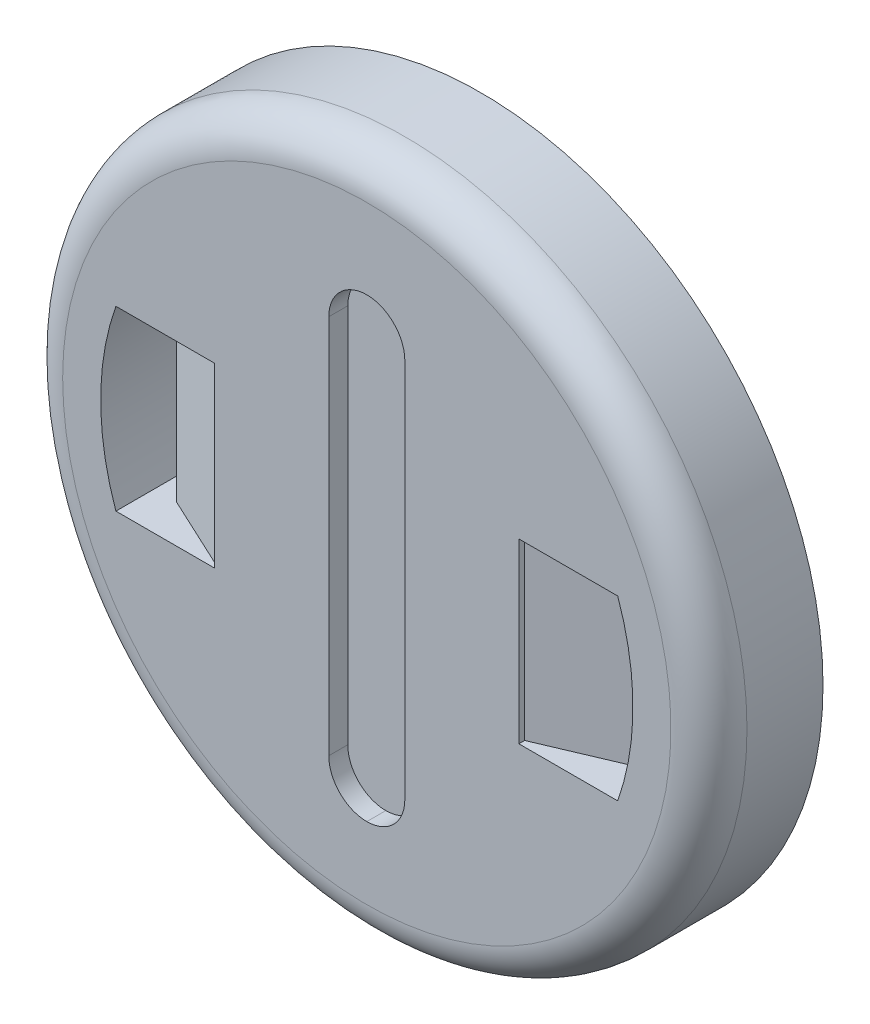
ISO-10303-21;
HEADER;
FILE_DESCRIPTION(('STEP AP214'),'2;1');
FILE_NAME('part.step','',(''),(''),'','','');
FILE_SCHEMA(('AUTOMOTIVE_DESIGN { 1 0 10303 214 1 1 1 1 }'));
ENDSEC;
DATA;
#1=APPLICATION_CONTEXT('core data for automotive mechanical design processes');
#2=APPLICATION_PROTOCOL_DEFINITION('international standard','automotive_design',2000,#1);
#3=PRODUCT_CONTEXT('',#1,'mechanical');
#4=PRODUCT('Part','Part','',(#3));
#5=PRODUCT_RELATED_PRODUCT_CATEGORY('part','',(#4));
#6=PRODUCT_DEFINITION_FORMATION('','',#4);
#7=PRODUCT_DEFINITION_CONTEXT('part definition',#1,'design');
#8=PRODUCT_DEFINITION('design','',#6,#7);
#9=PRODUCT_DEFINITION_SHAPE('','',#8);
#10=(LENGTH_UNIT() NAMED_UNIT(*) SI_UNIT(.MILLI.,.METRE.));
#11=(NAMED_UNIT(*) PLANE_ANGLE_UNIT() SI_UNIT($,.RADIAN.));
#12=(NAMED_UNIT(*) SI_UNIT($,.STERADIAN.) SOLID_ANGLE_UNIT());
#13=UNCERTAINTY_MEASURE_WITH_UNIT(LENGTH_MEASURE(1.E-05),#10,'distance_accuracy_value','');
#14=(GEOMETRIC_REPRESENTATION_CONTEXT(3) GLOBAL_UNCERTAINTY_ASSIGNED_CONTEXT((#13)) GLOBAL_UNIT_ASSIGNED_CONTEXT((#10,
#11,#12)) REPRESENTATION_CONTEXT('',''));
#15=CARTESIAN_POINT('',(0.,0.,0.));
#16=DIRECTION('',(0.,0.,1.));
#17=DIRECTION('',(1.,0.,0.));
#18=AXIS2_PLACEMENT_3D('',#15,#16,#17);
#19=CARTESIAN_POINT('',(0.,0.,14.));
#20=DIRECTION('',(0.,0.,1.));
#21=DIRECTION('',(1.,0.,0.));
#22=AXIS2_PLACEMENT_3D('',#19,#20,#21);
#23=CYLINDRICAL_SURFACE('',#22,7.);
#24=CARTESIAN_POINT('',(0.,0.,12.5));
#25=DIRECTION('',(0.,0.,-1.));
#26=DIRECTION('',(-1.,0.,0.));
#27=AXIS2_PLACEMENT_3D('',#24,#25,#26);
#28=CIRCLE('',#27,7.);
#29=CARTESIAN_POINT('',(6.59966329107444,-2.33333333333333,12.5));
#30=VERTEX_POINT('',#29);
#31=CARTESIAN_POINT('',(6.59966329107444,2.33333333333333,12.5));
#32=VERTEX_POINT('',#31);
#33=EDGE_CURVE('E304',#30,#32,#28,.F.);
#34=ORIENTED_EDGE('',*,*,#33,.F.);
#35=DIRECTION('',(0.,0.,1.));
#36=VECTOR('',#35,1.);
#37=CARTESIAN_POINT('',(6.59966329107444,-2.33333333333333,14.));
#38=LINE('',#37,#36);
#39=CARTESIAN_POINT('',(6.59966329107444,-2.33333333333333,15.));
#40=VERTEX_POINT('',#39);
#41=EDGE_CURVE('E220',#30,#40,#38,.T.);
#42=ORIENTED_EDGE('',*,*,#41,.T.);
#43=CARTESIAN_POINT('',(0.,0.,15.));
#44=DIRECTION('',(0.,0.,1.));
#45=DIRECTION('',(1.,0.,0.));
#46=AXIS2_PLACEMENT_3D('',#43,#44,#45);
#47=CIRCLE('',#46,7.);
#48=CARTESIAN_POINT('',(6.59966329107444,2.33333333333333,15.));
#49=VERTEX_POINT('',#48);
#50=EDGE_CURVE('E210',#40,#49,#47,.T.);
#51=ORIENTED_EDGE('',*,*,#50,.T.);
#52=DIRECTION('',(0.,0.,1.));
#53=VECTOR('',#52,1.);
#54=CARTESIAN_POINT('',(6.59966329107444,2.33333333333333,14.));
#55=LINE('',#54,#53);
#56=EDGE_CURVE('E218',#32,#49,#55,.T.);
#57=ORIENTED_EDGE('',*,*,#56,.F.);
#58=EDGE_LOOP('',(#34,#42,#51,#57));
#59=FACE_BOUND('',#58,.T.);
#60=ADVANCED_FACE('F35',(#59),#23,.F.);
#61=CARTESIAN_POINT('',(0.,0.,12.5));
#62=DIRECTION('',(0.,0.,-1.));
#63=DIRECTION('',(-1.,0.,0.));
#64=AXIS2_PLACEMENT_3D('',#61,#62,#63);
#65=CIRCLE('',#64,7.);
#66=CARTESIAN_POINT('',(-6.59966329107444,2.33333333333333,12.5));
#67=VERTEX_POINT('',#66);
#68=CARTESIAN_POINT('',(-6.59966329107444,-2.33333333333333,12.5));
#69=VERTEX_POINT('',#68);
#70=EDGE_CURVE('E312',#67,#69,#65,.F.);
#71=ORIENTED_EDGE('',*,*,#70,.F.);
#72=DIRECTION('',(0.,0.,1.));
#73=VECTOR('',#72,1.);
#74=CARTESIAN_POINT('',(-6.59966329107444,2.33333333333333,14.));
#75=LINE('',#74,#73);
#76=CARTESIAN_POINT('',(-6.59966329107444,2.33333333333333,15.));
#77=VERTEX_POINT('',#76);
#78=EDGE_CURVE('E171',#67,#77,#75,.T.);
#79=ORIENTED_EDGE('',*,*,#78,.T.);
#80=CARTESIAN_POINT('',(0.,0.,15.));
#81=DIRECTION('',(0.,0.,1.));
#82=DIRECTION('',(1.,0.,0.));
#83=AXIS2_PLACEMENT_3D('',#80,#81,#82);
#84=CIRCLE('',#83,7.);
#85=CARTESIAN_POINT('',(-6.59966329107444,-2.33333333333333,15.));
#86=VERTEX_POINT('',#85);
#87=EDGE_CURVE('E194',#77,#86,#84,.T.);
#88=ORIENTED_EDGE('',*,*,#87,.T.);
#89=DIRECTION('',(0.,0.,1.));
#90=VECTOR('',#89,1.);
#91=CARTESIAN_POINT('',(-6.59966329107444,-2.33333333333333,14.));
#92=LINE('',#91,#90);
#93=EDGE_CURVE('E204',#69,#86,#92,.T.);
#94=ORIENTED_EDGE('',*,*,#93,.F.);
#95=EDGE_LOOP('',(#71,#79,#88,#94));
#96=FACE_BOUND('',#95,.T.);
#97=ADVANCED_FACE('F348',(#96),#23,.F.);
#98=CARTESIAN_POINT('',(4.,2.33333333333333,14.));
#99=DIRECTION('',(0.,1.,0.));
#100=DIRECTION('',(0.,0.,1.));
#101=AXIS2_PLACEMENT_3D('',#98,#99,#100);
#102=PLANE('',#101);
#103=DIRECTION('',(-1.,0.,0.));
#104=VECTOR('',#103,1.);
#105=CARTESIAN_POINT('',(4.,2.33333333333333,12.5));
#106=LINE('',#105,#104);
#107=CARTESIAN_POINT('',(5.99999999999999,2.33333333333333,12.5));
#108=VERTEX_POINT('',#107);
#109=EDGE_CURVE('E51',#32,#108,#106,.T.);
#110=ORIENTED_EDGE('',*,*,#109,.F.);
#111=ORIENTED_EDGE('',*,*,#56,.T.);
#112=DIRECTION('',(-1.,0.,0.));
#113=VECTOR('',#112,1.);
#114=CARTESIAN_POINT('',(4.,2.33333333333333,15.));
#115=LINE('',#114,#113);
#116=CARTESIAN_POINT('',(4.,2.33333333333333,15.));
#117=VERTEX_POINT('',#116);
#118=EDGE_CURVE('E213',#49,#117,#115,.T.);
#119=ORIENTED_EDGE('',*,*,#118,.T.);
#120=DIRECTION('',(0.,0.,1.));
#121=VECTOR('',#120,1.);
#122=CARTESIAN_POINT('',(4.,2.33333333333333,14.));
#123=LINE('',#122,#121);
#124=CARTESIAN_POINT('',(4.,2.33333333333333,14.8489496324192));
#125=VERTEX_POINT('',#124);
#126=EDGE_CURVE('E192',#125,#117,#123,.T.);
#127=ORIENTED_EDGE('',*,*,#126,.F.);
#128=DIRECTION('',(0.920504853452439,0.,-0.390731128489278));
#129=VECTOR('',#128,1.);
#130=CARTESIAN_POINT('',(5.99999999999999,2.33333333333333,14.));
#131=LINE('',#130,#129);
#132=CARTESIAN_POINT('',(5.99999999999999,2.33333333333333,14.));
#133=VERTEX_POINT('',#132);
#134=EDGE_CURVE('E44',#125,#133,#131,.T.);
#135=ORIENTED_EDGE('',*,*,#134,.T.);
#136=DIRECTION('',(0.,0.,1.));
#137=VECTOR('',#136,1.);
#138=CARTESIAN_POINT('',(5.99999999999999,2.33333333333333,-7.24115958621575));
#139=LINE('',#138,#137);
#140=EDGE_CURVE('E296',#108,#133,#139,.T.);
#141=ORIENTED_EDGE('',*,*,#140,.F.);
#142=EDGE_LOOP('',(#110,#111,#119,#127,#135,#141));
#143=FACE_BOUND('',#142,.T.);
#144=ADVANCED_FACE('F295',(#143),#102,.F.);
#145=CARTESIAN_POINT('',(4.,-2.33333333333333,14.));
#146=DIRECTION('',(0.,-1.,0.));
#147=DIRECTION('',(0.,0.,-1.));
#148=AXIS2_PLACEMENT_3D('',#145,#146,#147);
#149=PLANE('',#148);
#150=DIRECTION('',(1.,0.,0.));
#151=VECTOR('',#150,1.);
#152=CARTESIAN_POINT('',(4.,-2.33333333333333,12.5));
#153=LINE('',#152,#151);
#154=CARTESIAN_POINT('',(5.99999999999999,-2.33333333333333,12.5));
#155=VERTEX_POINT('',#154);
#156=EDGE_CURVE('E309',#155,#30,#153,.T.);
#157=ORIENTED_EDGE('',*,*,#156,.F.);
#158=DIRECTION('',(0.,0.,1.));
#159=VECTOR('',#158,1.);
#160=CARTESIAN_POINT('',(5.99999999999999,-2.33333333333333,-7.24115958621575));
#161=LINE('',#160,#159);
#162=CARTESIAN_POINT('',(5.99999999999999,-2.33333333333333,14.));
#163=VERTEX_POINT('',#162);
#164=EDGE_CURVE('E184',#155,#163,#161,.T.);
#165=ORIENTED_EDGE('',*,*,#164,.T.);
#166=DIRECTION('',(-0.920504853452439,0.,0.390731128489278));
#167=VECTOR('',#166,1.);
#168=CARTESIAN_POINT('',(5.99999999999999,-2.33333333333333,14.));
#169=LINE('',#168,#167);
#170=CARTESIAN_POINT('',(4.,-2.33333333333333,14.8489496324192));
#171=VERTEX_POINT('',#170);
#172=EDGE_CURVE('E286',#163,#171,#169,.T.);
#173=ORIENTED_EDGE('',*,*,#172,.T.);
#174=DIRECTION('',(0.,0.,1.));
#175=VECTOR('',#174,1.);
#176=CARTESIAN_POINT('',(4.,-2.33333333333333,14.));
#177=LINE('',#176,#175);
#178=CARTESIAN_POINT('',(4.,-2.33333333333333,15.));
#179=VERTEX_POINT('',#178);
#180=EDGE_CURVE('E216',#171,#179,#177,.T.);
#181=ORIENTED_EDGE('',*,*,#180,.T.);
#182=DIRECTION('',(1.,0.,0.));
#183=VECTOR('',#182,1.);
#184=CARTESIAN_POINT('',(4.,-2.33333333333333,15.));
#185=LINE('',#184,#183);
#186=EDGE_CURVE('E182',#179,#40,#185,.T.);
#187=ORIENTED_EDGE('',*,*,#186,.T.);
#188=ORIENTED_EDGE('',*,*,#41,.F.);
#189=EDGE_LOOP('',(#157,#165,#173,#181,#187,#188));
#190=FACE_BOUND('',#189,.T.);
#191=ADVANCED_FACE('F370',(#190),#149,.F.);
#192=CARTESIAN_POINT('',(-6.59966329107444,-2.33333333333333,14.));
#193=DIRECTION('',(0.,-1.,0.));
#194=DIRECTION('',(1.,0.,0.));
#195=AXIS2_PLACEMENT_3D('',#192,#193,#194);
#196=PLANE('',#195);
#197=DIRECTION('',(1.,0.,0.));
#198=VECTOR('',#197,1.);
#199=CARTESIAN_POINT('',(-6.59966329107444,-2.33333333333333,12.5));
#200=LINE('',#199,#198);
#201=CARTESIAN_POINT('',(-5.99999999999998,-2.33333333333333,12.5));
#202=VERTEX_POINT('',#201);
#203=EDGE_CURVE('E58',#69,#202,#200,.T.);
#204=ORIENTED_EDGE('',*,*,#203,.F.);
#205=ORIENTED_EDGE('',*,*,#93,.T.);
#206=DIRECTION('',(1.,0.,0.));
#207=VECTOR('',#206,1.);
#208=CARTESIAN_POINT('',(-6.59966329107444,-2.33333333333333,15.));
#209=LINE('',#208,#207);
#210=CARTESIAN_POINT('',(-4.,-2.33333333333333,15.));
#211=VERTEX_POINT('',#210);
#212=EDGE_CURVE('E197',#86,#211,#209,.T.);
#213=ORIENTED_EDGE('',*,*,#212,.T.);
#214=DIRECTION('',(0.,0.,1.));
#215=VECTOR('',#214,1.);
#216=CARTESIAN_POINT('',(-4.,-2.33333333333333,14.));
#217=LINE('',#216,#215);
#218=CARTESIAN_POINT('',(-4.,-2.33333333333333,14.93261531631));
#219=VERTEX_POINT('',#218);
#220=EDGE_CURVE('E201',#219,#211,#217,.T.);
#221=ORIENTED_EDGE('',*,*,#220,.F.);
#222=DIRECTION('',(-0.906307787036647,0.,-0.422618261740704));
#223=VECTOR('',#222,1.);
#224=CARTESIAN_POINT('',(-5.99999999999998,-2.33333333333333,14.));
#225=LINE('',#224,#223);
#226=CARTESIAN_POINT('',(-5.99999999999998,-2.33333333333333,14.));
#227=VERTEX_POINT('',#226);
#228=EDGE_CURVE('E280',#219,#227,#225,.T.);
#229=ORIENTED_EDGE('',*,*,#228,.T.);
#230=DIRECTION('',(0.,0.,1.));
#231=VECTOR('',#230,1.);
#232=CARTESIAN_POINT('',(-5.99999999999998,-2.33333333333333,-7.24115958621575));
#233=LINE('',#232,#231);
#234=EDGE_CURVE('E179',#202,#227,#233,.T.);
#235=ORIENTED_EDGE('',*,*,#234,.F.);
#236=EDGE_LOOP('',(#204,#205,#213,#221,#229,#235));
#237=FACE_BOUND('',#236,.T.);
#238=ADVANCED_FACE('F358',(#237),#196,.F.);
#239=CARTESIAN_POINT('',(-6.59966329107444,2.33333333333333,14.));
#240=DIRECTION('',(0.,1.,0.));
#241=DIRECTION('',(0.,0.,1.));
#242=AXIS2_PLACEMENT_3D('',#239,#240,#241);
#243=PLANE('',#242);
#244=DIRECTION('',(-1.,0.,0.));
#245=VECTOR('',#244,1.);
#246=CARTESIAN_POINT('',(-6.59966329107444,2.33333333333333,12.5));
#247=LINE('',#246,#245);
#248=CARTESIAN_POINT('',(-5.99999999999998,2.33333333333333,12.5));
#249=VERTEX_POINT('',#248);
#250=EDGE_CURVE('E160',#249,#67,#247,.T.);
#251=ORIENTED_EDGE('',*,*,#250,.F.);
#252=DIRECTION('',(0.,0.,1.));
#253=VECTOR('',#252,1.);
#254=CARTESIAN_POINT('',(-5.99999999999998,2.33333333333333,-7.24115958621575));
#255=LINE('',#254,#253);
#256=CARTESIAN_POINT('',(-5.99999999999998,2.33333333333333,14.));
#257=VERTEX_POINT('',#256);
#258=EDGE_CURVE('E168',#249,#257,#255,.T.);
#259=ORIENTED_EDGE('',*,*,#258,.T.);
#260=DIRECTION('',(0.906307787036647,0.,0.422618261740704));
#261=VECTOR('',#260,1.);
#262=CARTESIAN_POINT('',(-5.99999999999998,2.33333333333333,14.));
#263=LINE('',#262,#261);
#264=CARTESIAN_POINT('',(-4.,2.33333333333333,14.93261531631));
#265=VERTEX_POINT('',#264);
#266=EDGE_CURVE('E276',#257,#265,#263,.T.);
#267=ORIENTED_EDGE('',*,*,#266,.T.);
#268=DIRECTION('',(0.,0.,1.));
#269=VECTOR('',#268,1.);
#270=CARTESIAN_POINT('',(-4.,2.33333333333333,14.));
#271=LINE('',#270,#269);
#272=CARTESIAN_POINT('',(-4.,2.33333333333333,15.));
#273=VERTEX_POINT('',#272);
#274=EDGE_CURVE('E200',#265,#273,#271,.T.);
#275=ORIENTED_EDGE('',*,*,#274,.T.);
#276=DIRECTION('',(-1.,0.,0.));
#277=VECTOR('',#276,1.);
#278=CARTESIAN_POINT('',(-6.59966329107444,2.33333333333333,15.));
#279=LINE('',#278,#277);
#280=EDGE_CURVE('E191',#273,#77,#279,.T.);
#281=ORIENTED_EDGE('',*,*,#280,.T.);
#282=ORIENTED_EDGE('',*,*,#78,.F.);
#283=EDGE_LOOP('',(#251,#259,#267,#275,#281,#282));
#284=FACE_BOUND('',#283,.T.);
#285=ADVANCED_FACE('F167',(#284),#243,.F.);
#286=CARTESIAN_POINT('',(5.99999999999999,2.33333333333333,-7.24115958621575));
#287=DIRECTION('',(-1.,0.,0.));
#288=DIRECTION('',(0.,0.,1.));
#289=AXIS2_PLACEMENT_3D('',#286,#287,#288);
#290=PLANE('',#289);
#291=DIRECTION('',(0.,-1.,0.));
#292=VECTOR('',#291,1.);
#293=CARTESIAN_POINT('',(5.99999999999999,2.33333333333333,12.5));
#294=LINE('',#293,#292);
#295=EDGE_CURVE('E303',#108,#155,#294,.T.);
#296=ORIENTED_EDGE('',*,*,#295,.F.);
#297=ORIENTED_EDGE('',*,*,#140,.T.);
#298=DIRECTION('',(0.,-1.,0.));
#299=VECTOR('',#298,1.);
#300=CARTESIAN_POINT('',(5.99999999999999,0.,14.));
#301=LINE('',#300,#299);
#302=EDGE_CURVE('E283',#133,#163,#301,.T.);
#303=ORIENTED_EDGE('',*,*,#302,.T.);
#304=ORIENTED_EDGE('',*,*,#164,.F.);
#305=EDGE_LOOP('',(#296,#297,#303,#304));
#306=FACE_BOUND('',#305,.T.);
#307=ADVANCED_FACE('F302',(#306),#290,.F.);
#308=CARTESIAN_POINT('',(-5.99999999999998,-2.33333333333333,-7.24115958621575));
#309=DIRECTION('',(1.,0.,0.));
#310=DIRECTION('',(0.,0.,-1.));
#311=AXIS2_PLACEMENT_3D('',#308,#309,#310);
#312=PLANE('',#311);
#313=DIRECTION('',(0.,1.,0.));
#314=VECTOR('',#313,1.);
#315=CARTESIAN_POINT('',(-5.99999999999998,-2.33333333333333,12.5));
#316=LINE('',#315,#314);
#317=EDGE_CURVE('E11',#202,#249,#316,.T.);
#318=ORIENTED_EDGE('',*,*,#317,.F.);
#319=ORIENTED_EDGE('',*,*,#234,.T.);
#320=DIRECTION('',(0.,1.,0.));
#321=VECTOR('',#320,1.);
#322=CARTESIAN_POINT('',(-5.99999999999998,0.,14.));
#323=LINE('',#322,#321);
#324=EDGE_CURVE('E177',#227,#257,#323,.T.);
#325=ORIENTED_EDGE('',*,*,#324,.T.);
#326=ORIENTED_EDGE('',*,*,#258,.F.);
#327=EDGE_LOOP('',(#318,#319,#325,#326));
#328=FACE_BOUND('',#327,.T.);
#329=ADVANCED_FACE('F175',(#328),#312,.F.);
#330=CARTESIAN_POINT('',(0.,0.,15.));
#331=DIRECTION('',(0.,0.,-1.));
#332=DIRECTION('',(-1.,0.,0.));
#333=AXIS2_PLACEMENT_3D('',#330,#331,#332);
#334=CYLINDRICAL_SURFACE('',#333,9.);
#335=CARTESIAN_POINT('',(0.,0.,14.));
#336=DIRECTION('',(0.,0.,-1.));
#337=DIRECTION('',(-1.,0.,0.));
#338=AXIS2_PLACEMENT_3D('',#335,#336,#337);
#339=CIRCLE('',#338,9.);
#340=CARTESIAN_POINT('',(-9.,0.,14.));
#341=VERTEX_POINT('',#340);
#342=EDGE_CURVE('E239',#341,#341,#339,.T.);
#343=ORIENTED_EDGE('',*,*,#342,.T.);
#344=EDGE_LOOP('',(#343));
#345=FACE_BOUND('',#344,.T.);
#346=CARTESIAN_POINT('',(0.,0.,12.));
#347=DIRECTION('',(0.,0.,-1.));
#348=DIRECTION('',(-1.,0.,0.));
#349=AXIS2_PLACEMENT_3D('',#346,#347,#348);
#350=CIRCLE('',#349,9.);
#351=CARTESIAN_POINT('',(-9.,0.,12.));
#352=VERTEX_POINT('',#351);
#353=EDGE_CURVE('E230',#352,#352,#350,.T.);
#354=ORIENTED_EDGE('',*,*,#353,.F.);
#355=EDGE_LOOP('',(#354));
#356=FACE_BOUND('',#355,.T.);
#357=ADVANCED_FACE('F335',(#345,#356),#334,.T.);
#358=CARTESIAN_POINT('',(0.,0.,15.));
#359=DIRECTION('',(0.,0.,-1.));
#360=DIRECTION('',(-1.,0.,0.));
#361=AXIS2_PLACEMENT_3D('',#358,#359,#360);
#362=PLANE('',#361);
#363=ORIENTED_EDGE('',*,*,#280,.F.);
#364=DIRECTION('',(0.,1.,0.));
#365=VECTOR('',#364,1.);
#366=CARTESIAN_POINT('',(-4.,2.33333333333333,15.));
#367=LINE('',#366,#365);
#368=EDGE_CURVE('E188',#211,#273,#367,.T.);
#369=ORIENTED_EDGE('',*,*,#368,.F.);
#370=ORIENTED_EDGE('',*,*,#212,.F.);
#371=ORIENTED_EDGE('',*,*,#87,.F.);
#372=EDGE_LOOP('',(#363,#369,#370,#371));
#373=FACE_BOUND('',#372,.T.);
#374=ORIENTED_EDGE('',*,*,#186,.F.);
#375=DIRECTION('',(0.,-1.,0.));
#376=VECTOR('',#375,1.);
#377=CARTESIAN_POINT('',(4.,2.33333333333333,15.));
#378=LINE('',#377,#376);
#379=EDGE_CURVE('E178',#117,#179,#378,.T.);
#380=ORIENTED_EDGE('',*,*,#379,.F.);
#381=ORIENTED_EDGE('',*,*,#118,.F.);
#382=ORIENTED_EDGE('',*,*,#50,.F.);
#383=EDGE_LOOP('',(#374,#380,#381,#382));
#384=FACE_BOUND('',#383,.T.);
#385=CARTESIAN_POINT('',(0.,-5.10540648566572,15.));
#386=DIRECTION('',(0.,0.,-1.));
#387=DIRECTION('',(-1.,0.,0.));
#388=AXIS2_PLACEMENT_3D('',#385,#386,#387);
#389=CIRCLE('',#388,1.);
#390=CARTESIAN_POINT('',(1.,-5.10540648566572,15.));
#391=VERTEX_POINT('',#390);
#392=CARTESIAN_POINT('',(0.,-6.10540648566572,15.));
#393=VERTEX_POINT('',#392);
#394=EDGE_CURVE('E263',#391,#393,#389,.T.);
#395=ORIENTED_EDGE('',*,*,#394,.T.);
#396=CARTESIAN_POINT('',(0.,-5.10540648566572,15.));
#397=DIRECTION('',(0.,0.,-1.));
#398=DIRECTION('',(-1.,0.,0.));
#399=AXIS2_PLACEMENT_3D('',#396,#397,#398);
#400=CIRCLE('',#399,1.);
#401=CARTESIAN_POINT('',(-0.999999999999998,-5.10540648566572,15.));
#402=VERTEX_POINT('',#401);
#403=EDGE_CURVE('E265',#393,#402,#400,.T.);
#404=ORIENTED_EDGE('',*,*,#403,.T.);
#405=DIRECTION('',(0.,-1.,0.));
#406=VECTOR('',#405,1.);
#407=CARTESIAN_POINT('',(-1.,5.89459351433428,15.));
#408=LINE('',#407,#406);
#409=CARTESIAN_POINT('',(-1.,4.89459351433428,15.));
#410=VERTEX_POINT('',#409);
#411=EDGE_CURVE('E231',#410,#402,#408,.T.);
#412=ORIENTED_EDGE('',*,*,#411,.F.);
#413=CARTESIAN_POINT('',(0.,4.89459351433428,15.));
#414=DIRECTION('',(0.,0.,-1.));
#415=DIRECTION('',(-1.,0.,0.));
#416=AXIS2_PLACEMENT_3D('',#413,#414,#415);
#417=CIRCLE('',#416,1.);
#418=CARTESIAN_POINT('',(0.,5.89459351433428,15.));
#419=VERTEX_POINT('',#418);
#420=EDGE_CURVE('E269',#410,#419,#417,.T.);
#421=ORIENTED_EDGE('',*,*,#420,.T.);
#422=CARTESIAN_POINT('',(0.,4.89459351433428,15.));
#423=DIRECTION('',(0.,0.,-1.));
#424=DIRECTION('',(-1.,0.,0.));
#425=AXIS2_PLACEMENT_3D('',#422,#423,#424);
#426=CIRCLE('',#425,1.);
#427=CARTESIAN_POINT('',(1.,4.89459351433428,15.));
#428=VERTEX_POINT('',#427);
#429=EDGE_CURVE('E267',#419,#428,#426,.T.);
#430=ORIENTED_EDGE('',*,*,#429,.T.);
#431=DIRECTION('',(0.,1.,0.));
#432=VECTOR('',#431,1.);
#433=CARTESIAN_POINT('',(1.,5.89459351433428,15.));
#434=LINE('',#433,#432);
#435=EDGE_CURVE('E227',#391,#428,#434,.T.);
#436=ORIENTED_EDGE('',*,*,#435,.F.);
#437=EDGE_LOOP('',(#395,#404,#412,#421,#430,#436));
#438=FACE_BOUND('',#437,.T.);
#439=CARTESIAN_POINT('',(0.,0.,15.));
#440=DIRECTION('',(0.,0.,-1.));
#441=DIRECTION('',(-1.,0.,0.));
#442=AXIS2_PLACEMENT_3D('',#439,#440,#441);
#443=CIRCLE('',#442,8.);
#444=CARTESIAN_POINT('',(-8.,0.,15.));
#445=VERTEX_POINT('',#444);
#446=EDGE_CURVE('E242',#445,#445,#443,.F.);
#447=ORIENTED_EDGE('',*,*,#446,.T.);
#448=EDGE_LOOP('',(#447));
#449=FACE_BOUND('',#448,.T.);
#450=ADVANCED_FACE('F331',(#373,#384,#438,#449),#362,.F.);
#451=CARTESIAN_POINT('',(0.,0.,12.));
#452=DIRECTION('',(0.,0.,-1.));
#453=DIRECTION('',(-1.,0.,0.));
#454=AXIS2_PLACEMENT_3D('',#451,#452,#453);
#455=PLANE('',#454);
#456=CARTESIAN_POINT('',(0.,0.,12.));
#457=DIRECTION('',(0.,0.,-1.));
#458=DIRECTION('',(-1.,0.,0.));
#459=AXIS2_PLACEMENT_3D('',#456,#457,#458);
#460=CIRCLE('',#459,8.);
#461=CARTESIAN_POINT('',(-8.,0.,12.));
#462=VERTEX_POINT('',#461);
#463=EDGE_CURVE('E315',#462,#462,#460,.T.);
#464=ORIENTED_EDGE('',*,*,#463,.F.);
#465=EDGE_LOOP('',(#464));
#466=FACE_BOUND('',#465,.T.);
#467=ORIENTED_EDGE('',*,*,#353,.T.);
#468=EDGE_LOOP('',(#467));
#469=FACE_BOUND('',#468,.T.);
#470=ADVANCED_FACE('F327',(#466,#469),#455,.T.);
#471=CARTESIAN_POINT('',(0.,0.,14.));
#472=DIRECTION('',(0.,0.,-1.));
#473=DIRECTION('',(-1.,0.,0.));
#474=AXIS2_PLACEMENT_3D('',#471,#472,#473);
#475=TOROIDAL_SURFACE('',#474,8.,1.);
#476=ORIENTED_EDGE('',*,*,#446,.F.);
#477=EDGE_LOOP('',(#476));
#478=FACE_BOUND('',#477,.T.);
#479=ORIENTED_EDGE('',*,*,#342,.F.);
#480=EDGE_LOOP('',(#479));
#481=FACE_BOUND('',#480,.T.);
#482=ADVANCED_FACE('F330',(#478,#481),#475,.T.);
#483=CARTESIAN_POINT('',(-1.,5.89459351433428,14.5));
#484=DIRECTION('',(-1.,0.,0.));
#485=DIRECTION('',(0.,-1.,0.));
#486=AXIS2_PLACEMENT_3D('',#483,#484,#485);
#487=PLANE('',#486);
#488=ORIENTED_EDGE('',*,*,#411,.T.);
#489=DIRECTION('',(0.,0.,1.));
#490=VECTOR('',#489,1.);
#491=CARTESIAN_POINT('',(-0.999999999999998,-5.10540648566572,14.5));
#492=LINE('',#491,#490);
#493=CARTESIAN_POINT('',(-0.999999999999998,-5.10540648566572,14.5));
#494=VERTEX_POINT('',#493);
#495=EDGE_CURVE('E261',#402,#494,#492,.F.);
#496=ORIENTED_EDGE('',*,*,#495,.T.);
#497=DIRECTION('',(0.,-1.,0.));
#498=VECTOR('',#497,1.);
#499=CARTESIAN_POINT('',(-1.,5.89459351433428,14.5));
#500=LINE('',#499,#498);
#501=CARTESIAN_POINT('',(-1.,4.89459351433428,14.5));
#502=VERTEX_POINT('',#501);
#503=EDGE_CURVE('E223',#502,#494,#500,.T.);
#504=ORIENTED_EDGE('',*,*,#503,.F.);
#505=DIRECTION('',(0.,0.,1.));
#506=VECTOR('',#505,1.);
#507=CARTESIAN_POINT('',(-1.,4.89459351433428,15.));
#508=LINE('',#507,#506);
#509=EDGE_CURVE('E259',#502,#410,#508,.T.);
#510=ORIENTED_EDGE('',*,*,#509,.T.);
#511=EDGE_LOOP('',(#488,#496,#504,#510));
#512=FACE_BOUND('',#511,.T.);
#513=ADVANCED_FACE('F386',(#512),#487,.F.);
#514=CARTESIAN_POINT('',(1.,5.89459351433428,14.5));
#515=DIRECTION('',(1.,0.,0.));
#516=DIRECTION('',(0.,1.,0.));
#517=AXIS2_PLACEMENT_3D('',#514,#515,#516);
#518=PLANE('',#517);
#519=DIRECTION('',(0.,1.,0.));
#520=VECTOR('',#519,1.);
#521=CARTESIAN_POINT('',(1.,5.89459351433428,14.5));
#522=LINE('',#521,#520);
#523=CARTESIAN_POINT('',(1.,-5.10540648566572,14.5));
#524=VERTEX_POINT('',#523);
#525=CARTESIAN_POINT('',(1.,4.89459351433428,14.5));
#526=VERTEX_POINT('',#525);
#527=EDGE_CURVE('E226',#524,#526,#522,.T.);
#528=ORIENTED_EDGE('',*,*,#527,.F.);
#529=DIRECTION('',(0.,0.,1.));
#530=VECTOR('',#529,1.);
#531=CARTESIAN_POINT('',(1.,-5.10540648566572,15.));
#532=LINE('',#531,#530);
#533=EDGE_CURVE('E248',#524,#391,#532,.T.);
#534=ORIENTED_EDGE('',*,*,#533,.T.);
#535=ORIENTED_EDGE('',*,*,#435,.T.);
#536=DIRECTION('',(0.,0.,1.));
#537=VECTOR('',#536,1.);
#538=CARTESIAN_POINT('',(1.,4.89459351433428,14.5));
#539=LINE('',#538,#537);
#540=EDGE_CURVE('E245',#428,#526,#539,.F.);
#541=ORIENTED_EDGE('',*,*,#540,.T.);
#542=EDGE_LOOP('',(#528,#534,#535,#541));
#543=FACE_BOUND('',#542,.T.);
#544=ADVANCED_FACE('F382',(#543),#518,.F.);
#545=CARTESIAN_POINT('',(0.,0.,14.5));
#546=DIRECTION('',(0.,0.,1.));
#547=DIRECTION('',(1.,0.,0.));
#548=AXIS2_PLACEMENT_3D('',#545,#546,#547);
#549=PLANE('',#548);
#550=CARTESIAN_POINT('',(0.,-5.10540648566572,14.5));
#551=DIRECTION('',(0.,0.,1.));
#552=DIRECTION('',(1.,0.,0.));
#553=AXIS2_PLACEMENT_3D('',#550,#551,#552);
#554=CIRCLE('',#553,1.);
#555=CARTESIAN_POINT('',(0.,-6.10540648566572,14.5));
#556=VERTEX_POINT('',#555);
#557=EDGE_CURVE('E255',#494,#556,#554,.T.);
#558=ORIENTED_EDGE('',*,*,#557,.T.);
#559=CARTESIAN_POINT('',(0.,-5.10540648566572,14.5));
#560=DIRECTION('',(0.,0.,1.));
#561=DIRECTION('',(1.,0.,0.));
#562=AXIS2_PLACEMENT_3D('',#559,#560,#561);
#563=CIRCLE('',#562,1.);
#564=EDGE_CURVE('E257',#556,#524,#563,.T.);
#565=ORIENTED_EDGE('',*,*,#564,.T.);
#566=ORIENTED_EDGE('',*,*,#527,.T.);
#567=CARTESIAN_POINT('',(0.,4.89459351433428,14.5));
#568=DIRECTION('',(0.,0.,1.));
#569=DIRECTION('',(1.,0.,0.));
#570=AXIS2_PLACEMENT_3D('',#567,#568,#569);
#571=CIRCLE('',#570,1.);
#572=CARTESIAN_POINT('',(0.,5.89459351433428,14.5));
#573=VERTEX_POINT('',#572);
#574=EDGE_CURVE('E253',#526,#573,#571,.T.);
#575=ORIENTED_EDGE('',*,*,#574,.T.);
#576=CARTESIAN_POINT('',(0.,4.89459351433428,14.5));
#577=DIRECTION('',(0.,0.,1.));
#578=DIRECTION('',(1.,0.,0.));
#579=AXIS2_PLACEMENT_3D('',#576,#577,#578);
#580=CIRCLE('',#579,1.);
#581=EDGE_CURVE('E251',#573,#502,#580,.T.);
#582=ORIENTED_EDGE('',*,*,#581,.T.);
#583=ORIENTED_EDGE('',*,*,#503,.T.);
#584=EDGE_LOOP('',(#558,#565,#566,#575,#582,#583));
#585=FACE_BOUND('',#584,.T.);
#586=ADVANCED_FACE('F378',(#585),#549,.T.);
#587=CARTESIAN_POINT('',(0.,-5.10540648566572,14.5));
#588=DIRECTION('',(0.,0.,-1.));
#589=DIRECTION('',(-1.,0.,0.));
#590=AXIS2_PLACEMENT_3D('',#587,#588,#589);
#591=CYLINDRICAL_SURFACE('',#590,1.);
#592=DIRECTION('',(0.,0.,1.));
#593=VECTOR('',#592,1.);
#594=CARTESIAN_POINT('',(0.,-6.10540648566572,15.));
#595=LINE('',#594,#593);
#596=EDGE_CURVE('E234',#556,#393,#595,.T.);
#597=ORIENTED_EDGE('',*,*,#596,.F.);
#598=ORIENTED_EDGE('',*,*,#557,.F.);
#599=ORIENTED_EDGE('',*,*,#495,.F.);
#600=ORIENTED_EDGE('',*,*,#403,.F.);
#601=EDGE_LOOP('',(#597,#598,#599,#600));
#602=FACE_BOUND('',#601,.T.);
#603=ADVANCED_FACE('F381',(#602),#591,.F.);
#604=CARTESIAN_POINT('',(0.,-5.10540648566572,14.5));
#605=DIRECTION('',(0.,0.,-1.));
#606=DIRECTION('',(-1.,0.,0.));
#607=AXIS2_PLACEMENT_3D('',#604,#605,#606);
#608=CYLINDRICAL_SURFACE('',#607,1.);
#609=ORIENTED_EDGE('',*,*,#564,.F.);
#610=ORIENTED_EDGE('',*,*,#596,.T.);
#611=ORIENTED_EDGE('',*,*,#394,.F.);
#612=ORIENTED_EDGE('',*,*,#533,.F.);
#613=EDGE_LOOP('',(#609,#610,#611,#612));
#614=FACE_BOUND('',#613,.T.);
#615=ADVANCED_FACE('F417',(#614),#608,.F.);
#616=CARTESIAN_POINT('',(0.,4.89459351433428,14.5));
#617=DIRECTION('',(0.,0.,-1.));
#618=DIRECTION('',(-1.,0.,0.));
#619=AXIS2_PLACEMENT_3D('',#616,#617,#618);
#620=CYLINDRICAL_SURFACE('',#619,1.);
#621=ORIENTED_EDGE('',*,*,#509,.F.);
#622=ORIENTED_EDGE('',*,*,#581,.F.);
#623=DIRECTION('',(0.,0.,1.));
#624=VECTOR('',#623,1.);
#625=CARTESIAN_POINT('',(0.,5.89459351433428,14.5));
#626=LINE('',#625,#624);
#627=EDGE_CURVE('E203',#419,#573,#626,.F.);
#628=ORIENTED_EDGE('',*,*,#627,.F.);
#629=ORIENTED_EDGE('',*,*,#420,.F.);
#630=EDGE_LOOP('',(#621,#622,#628,#629));
#631=FACE_BOUND('',#630,.T.);
#632=ADVANCED_FACE('F408',(#631),#620,.F.);
#633=CARTESIAN_POINT('',(0.,4.89459351433428,14.5));
#634=DIRECTION('',(0.,0.,-1.));
#635=DIRECTION('',(-1.,0.,0.));
#636=AXIS2_PLACEMENT_3D('',#633,#634,#635);
#637=CYLINDRICAL_SURFACE('',#636,1.);
#638=ORIENTED_EDGE('',*,*,#574,.F.);
#639=ORIENTED_EDGE('',*,*,#540,.F.);
#640=ORIENTED_EDGE('',*,*,#429,.F.);
#641=ORIENTED_EDGE('',*,*,#627,.T.);
#642=EDGE_LOOP('',(#638,#639,#640,#641));
#643=FACE_BOUND('',#642,.T.);
#644=ADVANCED_FACE('F376',(#643),#637,.F.);
#645=CARTESIAN_POINT('',(4.,2.33333333333333,14.));
#646=DIRECTION('',(-1.,0.,0.));
#647=DIRECTION('',(0.,0.,1.));
#648=AXIS2_PLACEMENT_3D('',#645,#646,#647);
#649=PLANE('',#648);
#650=ORIENTED_EDGE('',*,*,#180,.F.);
#651=DIRECTION('',(0.,1.,0.));
#652=VECTOR('',#651,1.);
#653=CARTESIAN_POINT('',(4.,2.33333333333333,14.8489496324192));
#654=LINE('',#653,#652);
#655=EDGE_CURVE('E288',#171,#125,#654,.T.);
#656=ORIENTED_EDGE('',*,*,#655,.T.);
#657=ORIENTED_EDGE('',*,*,#126,.T.);
#658=ORIENTED_EDGE('',*,*,#379,.T.);
#659=EDGE_LOOP('',(#650,#656,#657,#658));
#660=FACE_BOUND('',#659,.T.);
#661=ADVANCED_FACE('F366',(#660),#649,.F.);
#662=CARTESIAN_POINT('',(-4.,2.33333333333333,14.));
#663=DIRECTION('',(1.,0.,0.));
#664=DIRECTION('',(0.,0.,-1.));
#665=AXIS2_PLACEMENT_3D('',#662,#663,#664);
#666=PLANE('',#665);
#667=ORIENTED_EDGE('',*,*,#274,.F.);
#668=DIRECTION('',(0.,-1.,0.));
#669=VECTOR('',#668,1.);
#670=CARTESIAN_POINT('',(-4.,2.33333333333333,14.93261531631));
#671=LINE('',#670,#669);
#672=EDGE_CURVE('E278',#265,#219,#671,.T.);
#673=ORIENTED_EDGE('',*,*,#672,.T.);
#674=ORIENTED_EDGE('',*,*,#220,.T.);
#675=ORIENTED_EDGE('',*,*,#368,.T.);
#676=EDGE_LOOP('',(#667,#673,#674,#675));
#677=FACE_BOUND('',#676,.T.);
#678=ADVANCED_FACE('F362',(#677),#666,.F.);
#679=CARTESIAN_POINT('',(-5.99999999999998,0.,14.));
#680=DIRECTION('',(0.422618261740705,0.,-0.906307787036648));
#681=DIRECTION('',(0.,1.,0.));
#682=AXIS2_PLACEMENT_3D('',#679,#680,#681);
#683=PLANE('',#682);
#684=ORIENTED_EDGE('',*,*,#228,.F.);
#685=ORIENTED_EDGE('',*,*,#672,.F.);
#686=ORIENTED_EDGE('',*,*,#266,.F.);
#687=ORIENTED_EDGE('',*,*,#324,.F.);
#688=EDGE_LOOP('',(#684,#685,#686,#687));
#689=FACE_BOUND('',#688,.T.);
#690=ADVANCED_FACE('F365',(#689),#683,.F.);
#691=CARTESIAN_POINT('',(5.99999999999999,0.,14.));
#692=DIRECTION('',(-0.390731128489278,0.,-0.920504853452438));
#693=DIRECTION('',(0.,-1.,0.));
#694=AXIS2_PLACEMENT_3D('',#691,#692,#693);
#695=PLANE('',#694);
#696=ORIENTED_EDGE('',*,*,#134,.F.);
#697=ORIENTED_EDGE('',*,*,#655,.F.);
#698=ORIENTED_EDGE('',*,*,#172,.F.);
#699=ORIENTED_EDGE('',*,*,#302,.F.);
#700=EDGE_LOOP('',(#696,#697,#698,#699));
#701=FACE_BOUND('',#700,.T.);
#702=ADVANCED_FACE('F38',(#701),#695,.F.);
#703=CARTESIAN_POINT('',(0.,0.,12.5));
#704=DIRECTION('',(0.,0.,-1.));
#705=DIRECTION('',(-1.,0.,0.));
#706=AXIS2_PLACEMENT_3D('',#703,#704,#705);
#707=PLANE('',#706);
#708=ORIENTED_EDGE('',*,*,#70,.T.);
#709=ORIENTED_EDGE('',*,*,#203,.T.);
#710=ORIENTED_EDGE('',*,*,#317,.T.);
#711=ORIENTED_EDGE('',*,*,#250,.T.);
#712=EDGE_LOOP('',(#708,#709,#710,#711));
#713=FACE_BOUND('',#712,.T.);
#714=CARTESIAN_POINT('',(0.,0.,12.5));
#715=DIRECTION('',(0.,0.,-1.));
#716=DIRECTION('',(-1.,0.,0.));
#717=AXIS2_PLACEMENT_3D('',#714,#715,#716);
#718=CIRCLE('',#717,8.);
#719=CARTESIAN_POINT('',(-8.,0.,12.5));
#720=VERTEX_POINT('',#719);
#721=EDGE_CURVE('E172',#720,#720,#718,.T.);
#722=ORIENTED_EDGE('',*,*,#721,.T.);
#723=EDGE_LOOP('',(#722));
#724=FACE_BOUND('',#723,.T.);
#725=ORIENTED_EDGE('',*,*,#33,.T.);
#726=ORIENTED_EDGE('',*,*,#109,.T.);
#727=ORIENTED_EDGE('',*,*,#295,.T.);
#728=ORIENTED_EDGE('',*,*,#156,.T.);
#729=EDGE_LOOP('',(#725,#726,#727,#728));
#730=FACE_BOUND('',#729,.T.);
#731=ADVANCED_FACE('F158',(#713,#724,#730),#707,.T.);
#732=CARTESIAN_POINT('',(0.,0.,12.5));
#733=DIRECTION('',(0.,0.,-1.));
#734=DIRECTION('',(-1.,0.,0.));
#735=AXIS2_PLACEMENT_3D('',#732,#733,#734);
#736=CYLINDRICAL_SURFACE('',#735,8.);
#737=ORIENTED_EDGE('',*,*,#721,.F.);
#738=EDGE_LOOP('',(#737));
#739=FACE_BOUND('',#738,.T.);
#740=ORIENTED_EDGE('',*,*,#463,.T.);
#741=EDGE_LOOP('',(#740));
#742=FACE_BOUND('',#741,.T.);
#743=ADVANCED_FACE('F321',(#739,#742),#736,.F.);
#744=CLOSED_SHELL('',(#60,#97,#144,#191,#238,#285,#307,#329,#357,#450,#470,#482,#513,#544,#586,
#603,#615,#632,#644,#661,#678,#690,#702,#731,#743));
#745=MANIFOLD_SOLID_BREP('B2',#744);
#746=ADVANCED_BREP_SHAPE_REPRESENTATION('',(#18,#745),#14);
#747=SHAPE_DEFINITION_REPRESENTATION(#9,#746);
ENDSEC;
END-ISO-10303-21;
